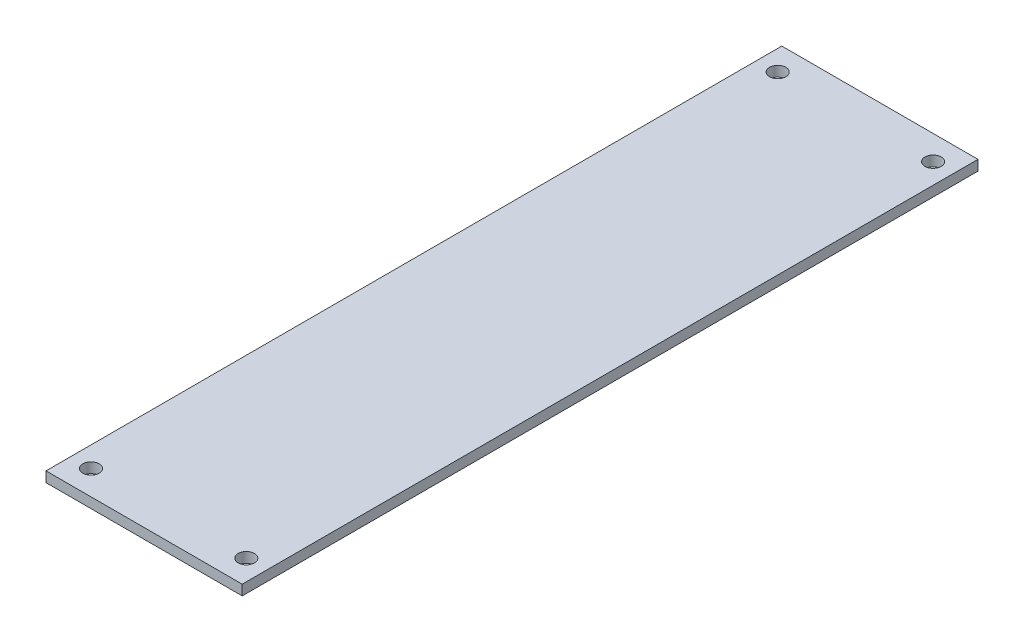
ISO-10303-21;
HEADER;
FILE_DESCRIPTION(('STEP AP214'),'2;1');
FILE_NAME('part.step','',(''),(''),'','','');
FILE_SCHEMA(('AUTOMOTIVE_DESIGN { 1 0 10303 214 1 1 1 1 }'));
ENDSEC;
DATA;
#1=APPLICATION_CONTEXT('core data for automotive mechanical design processes');
#2=APPLICATION_PROTOCOL_DEFINITION('international standard','automotive_design',2000,#1);
#3=PRODUCT_CONTEXT('',#1,'mechanical');
#4=PRODUCT('Part','Part','',(#3));
#5=PRODUCT_RELATED_PRODUCT_CATEGORY('part','',(#4));
#6=PRODUCT_DEFINITION_FORMATION('','',#4);
#7=PRODUCT_DEFINITION_CONTEXT('part definition',#1,'design');
#8=PRODUCT_DEFINITION('design','',#6,#7);
#9=PRODUCT_DEFINITION_SHAPE('','',#8);
#10=(LENGTH_UNIT() NAMED_UNIT(*) SI_UNIT(.MILLI.,.METRE.));
#11=(NAMED_UNIT(*) PLANE_ANGLE_UNIT() SI_UNIT($,.RADIAN.));
#12=(NAMED_UNIT(*) SI_UNIT($,.STERADIAN.) SOLID_ANGLE_UNIT());
#13=UNCERTAINTY_MEASURE_WITH_UNIT(LENGTH_MEASURE(1.E-05),#10,'distance_accuracy_value','');
#14=(GEOMETRIC_REPRESENTATION_CONTEXT(3) GLOBAL_UNCERTAINTY_ASSIGNED_CONTEXT((#13)) GLOBAL_UNIT_ASSIGNED_CONTEXT((#10,
#11,#12)) REPRESENTATION_CONTEXT('',''));
#15=CARTESIAN_POINT('',(0.,0.,0.));
#16=DIRECTION('',(0.,0.,1.));
#17=DIRECTION('',(1.,0.,0.));
#18=AXIS2_PLACEMENT_3D('',#15,#16,#17);
#19=CARTESIAN_POINT('',(30.48,3.175,114.3));
#20=DIRECTION('',(-1.,0.,0.));
#21=DIRECTION('',(0.,0.,1.));
#22=AXIS2_PLACEMENT_3D('',#19,#20,#21);
#23=PLANE('',#22);
#24=DIRECTION('',(0.,0.,-1.));
#25=VECTOR('',#24,1.);
#26=CARTESIAN_POINT('',(30.48,0.,114.3));
#27=LINE('',#26,#25);
#28=CARTESIAN_POINT('',(30.48,0.,114.3));
#29=VERTEX_POINT('',#28);
#30=CARTESIAN_POINT('',(30.48,0.,-114.3));
#31=VERTEX_POINT('',#30);
#32=EDGE_CURVE('E114',#29,#31,#27,.T.);
#33=ORIENTED_EDGE('',*,*,#32,.T.);
#34=DIRECTION('',(0.,-1.,0.));
#35=VECTOR('',#34,1.);
#36=CARTESIAN_POINT('',(30.48,3.175,-114.3));
#37=LINE('',#36,#35);
#38=CARTESIAN_POINT('',(30.48,3.175,-114.3));
#39=VERTEX_POINT('',#38);
#40=EDGE_CURVE('E11',#39,#31,#37,.T.);
#41=ORIENTED_EDGE('',*,*,#40,.F.);
#42=DIRECTION('',(0.,0.,-1.));
#43=VECTOR('',#42,1.);
#44=CARTESIAN_POINT('',(30.48,3.175,114.3));
#45=LINE('',#44,#43);
#46=CARTESIAN_POINT('',(30.48,3.175,114.3));
#47=VERTEX_POINT('',#46);
#48=EDGE_CURVE('E100',#47,#39,#45,.T.);
#49=ORIENTED_EDGE('',*,*,#48,.F.);
#50=DIRECTION('',(0.,-1.,0.));
#51=VECTOR('',#50,1.);
#52=CARTESIAN_POINT('',(30.48,3.175,114.3));
#53=LINE('',#52,#51);
#54=EDGE_CURVE('E108',#47,#29,#53,.T.);
#55=ORIENTED_EDGE('',*,*,#54,.T.);
#56=EDGE_LOOP('',(#33,#41,#49,#55));
#57=FACE_BOUND('',#56,.T.);
#58=ADVANCED_FACE('F44',(#57),#23,.F.);
#59=CARTESIAN_POINT('',(-30.48,3.175,-114.3));
#60=DIRECTION('',(0.,0.,1.));
#61=DIRECTION('',(1.,0.,0.));
#62=AXIS2_PLACEMENT_3D('',#59,#60,#61);
#63=PLANE('',#62);
#64=DIRECTION('',(-1.,0.,0.));
#65=VECTOR('',#64,1.);
#66=CARTESIAN_POINT('',(-30.48,0.,-114.3));
#67=LINE('',#66,#65);
#68=CARTESIAN_POINT('',(-30.48,0.,-114.3));
#69=VERTEX_POINT('',#68);
#70=EDGE_CURVE('E105',#31,#69,#67,.T.);
#71=ORIENTED_EDGE('',*,*,#70,.T.);
#72=DIRECTION('',(0.,-1.,0.));
#73=VECTOR('',#72,1.);
#74=CARTESIAN_POINT('',(-30.48,3.175,-114.3));
#75=LINE('',#74,#73);
#76=CARTESIAN_POINT('',(-30.48,3.175,-114.3));
#77=VERTEX_POINT('',#76);
#78=EDGE_CURVE('E53',#77,#69,#75,.T.);
#79=ORIENTED_EDGE('',*,*,#78,.F.);
#80=DIRECTION('',(-1.,0.,0.));
#81=VECTOR('',#80,1.);
#82=CARTESIAN_POINT('',(-30.48,3.175,-114.3));
#83=LINE('',#82,#81);
#84=EDGE_CURVE('E95',#39,#77,#83,.T.);
#85=ORIENTED_EDGE('',*,*,#84,.F.);
#86=ORIENTED_EDGE('',*,*,#40,.T.);
#87=EDGE_LOOP('',(#71,#79,#85,#86));
#88=FACE_BOUND('',#87,.T.);
#89=ADVANCED_FACE('F101',(#88),#63,.F.);
#90=CARTESIAN_POINT('',(-30.48,3.175,114.3));
#91=DIRECTION('',(1.,0.,0.));
#92=DIRECTION('',(0.,0.,-1.));
#93=AXIS2_PLACEMENT_3D('',#90,#91,#92);
#94=PLANE('',#93);
#95=DIRECTION('',(0.,0.,1.));
#96=VECTOR('',#95,1.);
#97=CARTESIAN_POINT('',(-30.48,0.,114.3));
#98=LINE('',#97,#96);
#99=CARTESIAN_POINT('',(-30.48,0.,114.3));
#100=VERTEX_POINT('',#99);
#101=EDGE_CURVE('E78',#69,#100,#98,.T.);
#102=ORIENTED_EDGE('',*,*,#101,.T.);
#103=DIRECTION('',(0.,-1.,0.));
#104=VECTOR('',#103,1.);
#105=CARTESIAN_POINT('',(-30.48,3.175,114.3));
#106=LINE('',#105,#104);
#107=CARTESIAN_POINT('',(-30.48,3.175,114.3));
#108=VERTEX_POINT('',#107);
#109=EDGE_CURVE('E102',#108,#100,#106,.T.);
#110=ORIENTED_EDGE('',*,*,#109,.F.);
#111=DIRECTION('',(0.,0.,1.));
#112=VECTOR('',#111,1.);
#113=CARTESIAN_POINT('',(-30.48,3.175,114.3));
#114=LINE('',#113,#112);
#115=EDGE_CURVE('E92',#77,#108,#114,.T.);
#116=ORIENTED_EDGE('',*,*,#115,.F.);
#117=ORIENTED_EDGE('',*,*,#78,.T.);
#118=EDGE_LOOP('',(#102,#110,#116,#117));
#119=FACE_BOUND('',#118,.T.);
#120=ADVANCED_FACE('F104',(#119),#94,.F.);
#121=CARTESIAN_POINT('',(-30.48,3.175,114.3));
#122=DIRECTION('',(0.,0.,-1.));
#123=DIRECTION('',(-1.,0.,0.));
#124=AXIS2_PLACEMENT_3D('',#121,#122,#123);
#125=PLANE('',#124);
#126=DIRECTION('',(1.,0.,0.));
#127=VECTOR('',#126,1.);
#128=CARTESIAN_POINT('',(-30.48,0.,114.3));
#129=LINE('',#128,#127);
#130=EDGE_CURVE('E84',#100,#29,#129,.T.);
#131=ORIENTED_EDGE('',*,*,#130,.T.);
#132=ORIENTED_EDGE('',*,*,#54,.F.);
#133=DIRECTION('',(1.,0.,0.));
#134=VECTOR('',#133,1.);
#135=CARTESIAN_POINT('',(-30.48,3.175,114.3));
#136=LINE('',#135,#134);
#137=EDGE_CURVE('E65',#108,#47,#136,.T.);
#138=ORIENTED_EDGE('',*,*,#137,.F.);
#139=ORIENTED_EDGE('',*,*,#109,.T.);
#140=EDGE_LOOP('',(#131,#132,#138,#139));
#141=FACE_BOUND('',#140,.T.);
#142=ADVANCED_FACE('F130',(#141),#125,.F.);
#143=CARTESIAN_POINT('',(0.,3.175,0.));
#144=DIRECTION('',(0.,-1.,0.));
#145=DIRECTION('',(0.,0.,-1.));
#146=AXIS2_PLACEMENT_3D('',#143,#144,#145);
#147=PLANE('',#146);
#148=CARTESIAN_POINT('',(24.13,3.175,106.68));
#149=DIRECTION('',(0.,1.,0.));
#150=DIRECTION('',(0.,0.,1.));
#151=AXIS2_PLACEMENT_3D('',#148,#149,#150);
#152=CIRCLE('',#151,2.54);
#153=CARTESIAN_POINT('',(24.13,3.175,109.22));
#154=VERTEX_POINT('',#153);
#155=EDGE_CURVE('E148',#154,#154,#152,.T.);
#156=ORIENTED_EDGE('',*,*,#155,.F.);
#157=EDGE_LOOP('',(#156));
#158=FACE_BOUND('',#157,.T.);
#159=CARTESIAN_POINT('',(-24.13,3.175,106.68));
#160=DIRECTION('',(0.,1.,0.));
#161=DIRECTION('',(0.,0.,1.));
#162=AXIS2_PLACEMENT_3D('',#159,#160,#161);
#163=CIRCLE('',#162,2.54);
#164=CARTESIAN_POINT('',(-24.13,3.175,109.22));
#165=VERTEX_POINT('',#164);
#166=EDGE_CURVE('E152',#165,#165,#163,.T.);
#167=ORIENTED_EDGE('',*,*,#166,.F.);
#168=EDGE_LOOP('',(#167));
#169=FACE_BOUND('',#168,.T.);
#170=CARTESIAN_POINT('',(-24.13,3.175,-106.68));
#171=DIRECTION('',(0.,1.,0.));
#172=DIRECTION('',(0.,0.,1.));
#173=AXIS2_PLACEMENT_3D('',#170,#171,#172);
#174=CIRCLE('',#173,2.54);
#175=CARTESIAN_POINT('',(-24.13,3.175,-104.14));
#176=VERTEX_POINT('',#175);
#177=EDGE_CURVE('E137',#176,#176,#174,.T.);
#178=ORIENTED_EDGE('',*,*,#177,.F.);
#179=EDGE_LOOP('',(#178));
#180=FACE_BOUND('',#179,.T.);
#181=CARTESIAN_POINT('',(24.13,3.175,-106.68));
#182=DIRECTION('',(0.,1.,0.));
#183=DIRECTION('',(0.,0.,1.));
#184=AXIS2_PLACEMENT_3D('',#181,#182,#183);
#185=CIRCLE('',#184,2.54);
#186=CARTESIAN_POINT('',(24.13,3.175,-104.14));
#187=VERTEX_POINT('',#186);
#188=EDGE_CURVE('E133',#187,#187,#185,.T.);
#189=ORIENTED_EDGE('',*,*,#188,.F.);
#190=EDGE_LOOP('',(#189));
#191=FACE_BOUND('',#190,.T.);
#192=ORIENTED_EDGE('',*,*,#48,.T.);
#193=ORIENTED_EDGE('',*,*,#84,.T.);
#194=ORIENTED_EDGE('',*,*,#115,.T.);
#195=ORIENTED_EDGE('',*,*,#137,.T.);
#196=EDGE_LOOP('',(#192,#193,#194,#195));
#197=FACE_BOUND('',#196,.T.);
#198=ADVANCED_FACE('F91',(#158,#169,#180,#191,#197),#147,.F.);
#199=CARTESIAN_POINT('',(0.,0.,0.));
#200=DIRECTION('',(0.,-1.,0.));
#201=DIRECTION('',(0.,0.,-1.));
#202=AXIS2_PLACEMENT_3D('',#199,#200,#201);
#203=PLANE('',#202);
#204=CARTESIAN_POINT('',(24.13,0.,106.68));
#205=DIRECTION('',(0.,1.,0.));
#206=DIRECTION('',(0.,0.,1.));
#207=AXIS2_PLACEMENT_3D('',#204,#205,#206);
#208=CIRCLE('',#207,2.54);
#209=CARTESIAN_POINT('',(24.13,0.,109.22));
#210=VERTEX_POINT('',#209);
#211=EDGE_CURVE('E142',#210,#210,#208,.T.);
#212=ORIENTED_EDGE('',*,*,#211,.T.);
#213=EDGE_LOOP('',(#212));
#214=FACE_BOUND('',#213,.T.);
#215=CARTESIAN_POINT('',(-24.13,0.,106.68));
#216=DIRECTION('',(0.,1.,0.));
#217=DIRECTION('',(0.,0.,1.));
#218=AXIS2_PLACEMENT_3D('',#215,#216,#217);
#219=CIRCLE('',#218,2.54);
#220=CARTESIAN_POINT('',(-24.13,0.,109.22));
#221=VERTEX_POINT('',#220);
#222=EDGE_CURVE('E147',#221,#221,#219,.T.);
#223=ORIENTED_EDGE('',*,*,#222,.T.);
#224=EDGE_LOOP('',(#223));
#225=FACE_BOUND('',#224,.T.);
#226=CARTESIAN_POINT('',(-24.13,0.,-106.68));
#227=DIRECTION('',(0.,1.,0.));
#228=DIRECTION('',(0.,0.,1.));
#229=AXIS2_PLACEMENT_3D('',#226,#227,#228);
#230=CIRCLE('',#229,2.54);
#231=CARTESIAN_POINT('',(-24.13,0.,-104.14));
#232=VERTEX_POINT('',#231);
#233=EDGE_CURVE('E158',#232,#232,#230,.T.);
#234=ORIENTED_EDGE('',*,*,#233,.T.);
#235=EDGE_LOOP('',(#234));
#236=FACE_BOUND('',#235,.T.);
#237=CARTESIAN_POINT('',(24.13,0.,-106.68));
#238=DIRECTION('',(0.,1.,0.));
#239=DIRECTION('',(0.,0.,1.));
#240=AXIS2_PLACEMENT_3D('',#237,#238,#239);
#241=CIRCLE('',#240,2.54);
#242=CARTESIAN_POINT('',(24.13,0.,-104.14));
#243=VERTEX_POINT('',#242);
#244=EDGE_CURVE('E120',#243,#243,#241,.T.);
#245=ORIENTED_EDGE('',*,*,#244,.T.);
#246=EDGE_LOOP('',(#245));
#247=FACE_BOUND('',#246,.T.);
#248=ORIENTED_EDGE('',*,*,#32,.F.);
#249=ORIENTED_EDGE('',*,*,#130,.F.);
#250=ORIENTED_EDGE('',*,*,#101,.F.);
#251=ORIENTED_EDGE('',*,*,#70,.F.);
#252=EDGE_LOOP('',(#248,#249,#250,#251));
#253=FACE_BOUND('',#252,.T.);
#254=ADVANCED_FACE('F128',(#214,#225,#236,#247,#253),#203,.T.);
#255=CARTESIAN_POINT('',(24.13,0.,-106.68));
#256=DIRECTION('',(0.,1.,0.));
#257=DIRECTION('',(0.,0.,1.));
#258=AXIS2_PLACEMENT_3D('',#255,#256,#257);
#259=CYLINDRICAL_SURFACE('',#258,2.54);
#260=ORIENTED_EDGE('',*,*,#244,.F.);
#261=EDGE_LOOP('',(#260));
#262=FACE_BOUND('',#261,.T.);
#263=ORIENTED_EDGE('',*,*,#188,.T.);
#264=EDGE_LOOP('',(#263));
#265=FACE_BOUND('',#264,.T.);
#266=ADVANCED_FACE('F173',(#262,#265),#259,.F.);
#267=CARTESIAN_POINT('',(-24.13,0.,-106.68));
#268=DIRECTION('',(0.,1.,0.));
#269=DIRECTION('',(0.,0.,1.));
#270=AXIS2_PLACEMENT_3D('',#267,#268,#269);
#271=CYLINDRICAL_SURFACE('',#270,2.54);
#272=ORIENTED_EDGE('',*,*,#233,.F.);
#273=EDGE_LOOP('',(#272));
#274=FACE_BOUND('',#273,.T.);
#275=ORIENTED_EDGE('',*,*,#177,.T.);
#276=EDGE_LOOP('',(#275));
#277=FACE_BOUND('',#276,.T.);
#278=ADVANCED_FACE('F167',(#274,#277),#271,.F.);
#279=CARTESIAN_POINT('',(-24.13,0.,106.68));
#280=DIRECTION('',(0.,1.,0.));
#281=DIRECTION('',(0.,0.,1.));
#282=AXIS2_PLACEMENT_3D('',#279,#280,#281);
#283=CYLINDRICAL_SURFACE('',#282,2.54);
#284=ORIENTED_EDGE('',*,*,#222,.F.);
#285=EDGE_LOOP('',(#284));
#286=FACE_BOUND('',#285,.T.);
#287=ORIENTED_EDGE('',*,*,#166,.T.);
#288=EDGE_LOOP('',(#287));
#289=FACE_BOUND('',#288,.T.);
#290=ADVANCED_FACE('F185',(#286,#289),#283,.F.);
#291=CARTESIAN_POINT('',(24.13,0.,106.68));
#292=DIRECTION('',(0.,1.,0.));
#293=DIRECTION('',(0.,0.,1.));
#294=AXIS2_PLACEMENT_3D('',#291,#292,#293);
#295=CYLINDRICAL_SURFACE('',#294,2.54);
#296=ORIENTED_EDGE('',*,*,#211,.F.);
#297=EDGE_LOOP('',(#296));
#298=FACE_BOUND('',#297,.T.);
#299=ORIENTED_EDGE('',*,*,#155,.T.);
#300=EDGE_LOOP('',(#299));
#301=FACE_BOUND('',#300,.T.);
#302=ADVANCED_FACE('F232',(#298,#301),#295,.F.);
#303=CLOSED_SHELL('',(#58,#89,#120,#142,#198,#254,#266,#278,#290,#302));
#304=MANIFOLD_SOLID_BREP('B2',#303);
#305=ADVANCED_BREP_SHAPE_REPRESENTATION('',(#18,#304),#14);
#306=SHAPE_DEFINITION_REPRESENTATION(#9,#305);
ENDSEC;
END-ISO-10303-21;
